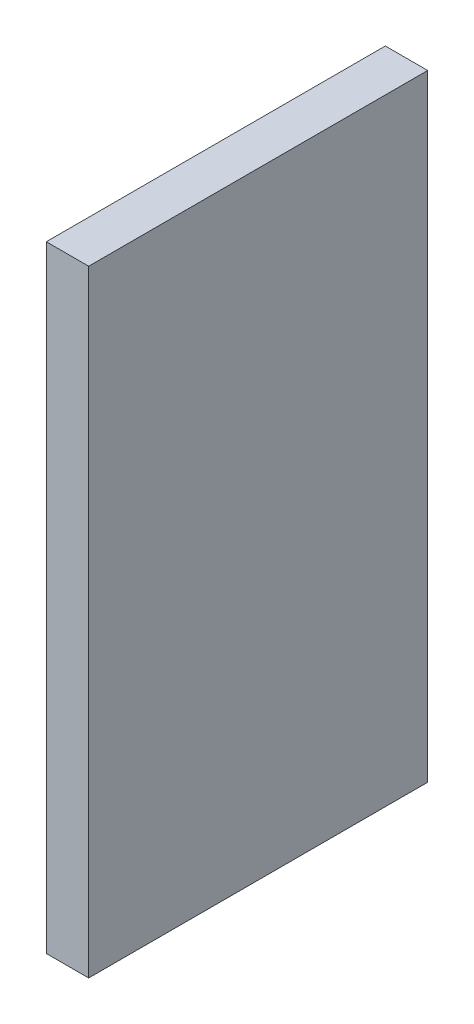
ISO-10303-21;
HEADER;
FILE_DESCRIPTION(('STEP AP214'),'2;1');
FILE_NAME('part.step','',(''),(''),'','','');
FILE_SCHEMA(('AUTOMOTIVE_DESIGN { 1 0 10303 214 1 1 1 1 }'));
ENDSEC;
DATA;
#1=APPLICATION_CONTEXT('core data for automotive mechanical design processes');
#2=APPLICATION_PROTOCOL_DEFINITION('international standard','automotive_design',2000,#1);
#3=PRODUCT_CONTEXT('',#1,'mechanical');
#4=PRODUCT('Part','Part','',(#3));
#5=PRODUCT_RELATED_PRODUCT_CATEGORY('part','',(#4));
#6=PRODUCT_DEFINITION_FORMATION('','',#4);
#7=PRODUCT_DEFINITION_CONTEXT('part definition',#1,'design');
#8=PRODUCT_DEFINITION('design','',#6,#7);
#9=PRODUCT_DEFINITION_SHAPE('','',#8);
#10=(LENGTH_UNIT() NAMED_UNIT(*) SI_UNIT(.MILLI.,.METRE.));
#11=(NAMED_UNIT(*) PLANE_ANGLE_UNIT() SI_UNIT($,.RADIAN.));
#12=(NAMED_UNIT(*) SI_UNIT($,.STERADIAN.) SOLID_ANGLE_UNIT());
#13=UNCERTAINTY_MEASURE_WITH_UNIT(LENGTH_MEASURE(1.E-05),#10,'distance_accuracy_value','');
#14=(GEOMETRIC_REPRESENTATION_CONTEXT(3) GLOBAL_UNCERTAINTY_ASSIGNED_CONTEXT((#13)) GLOBAL_UNIT_ASSIGNED_CONTEXT((#10,
#11,#12)) REPRESENTATION_CONTEXT('',''));
#15=CARTESIAN_POINT('',(0.,0.,0.));
#16=DIRECTION('',(0.,0.,1.));
#17=DIRECTION('',(1.,0.,0.));
#18=AXIS2_PLACEMENT_3D('',#15,#16,#17);
#19=CARTESIAN_POINT('',(-67.5840723809996,476.478485814157,27.94));
#20=DIRECTION('',(0.,-1.,0.));
#21=DIRECTION('',(0.,0.,-1.));
#22=AXIS2_PLACEMENT_3D('',#19,#20,#21);
#23=PLANE('',#22);
#24=DIRECTION('',(-1.,0.,0.));
#25=VECTOR('',#24,1.);
#26=CARTESIAN_POINT('',(-67.5840723809996,476.478485814157,-27.94));
#27=LINE('',#26,#25);
#28=CARTESIAN_POINT('',(-67.5840723809996,476.478485814157,-27.94));
#29=VERTEX_POINT('',#28);
#30=CARTESIAN_POINT('',(-74.5690723809996,476.478485814157,-27.94));
#31=VERTEX_POINT('',#30);
#32=EDGE_CURVE('E105',#29,#31,#27,.T.);
#33=ORIENTED_EDGE('',*,*,#32,.T.);
#34=DIRECTION('',(0.,0.,-1.));
#35=VECTOR('',#34,1.);
#36=CARTESIAN_POINT('',(-74.5690723809996,476.478485814157,27.94));
#37=LINE('',#36,#35);
#38=CARTESIAN_POINT('',(-74.5690723809996,476.478485814157,27.94));
#39=VERTEX_POINT('',#38);
#40=EDGE_CURVE('E11',#39,#31,#37,.T.);
#41=ORIENTED_EDGE('',*,*,#40,.F.);
#42=DIRECTION('',(-1.,0.,0.));
#43=VECTOR('',#42,1.);
#44=CARTESIAN_POINT('',(-67.5840723809996,476.478485814157,27.94));
#45=LINE('',#44,#43);
#46=CARTESIAN_POINT('',(-67.5840723809996,476.478485814157,27.94));
#47=VERTEX_POINT('',#46);
#48=EDGE_CURVE('E89',#47,#39,#45,.T.);
#49=ORIENTED_EDGE('',*,*,#48,.F.);
#50=DIRECTION('',(0.,0.,-1.));
#51=VECTOR('',#50,1.);
#52=CARTESIAN_POINT('',(-67.5840723809996,476.478485814157,27.94));
#53=LINE('',#52,#51);
#54=EDGE_CURVE('E96',#47,#29,#53,.T.);
#55=ORIENTED_EDGE('',*,*,#54,.T.);
#56=EDGE_LOOP('',(#33,#41,#49,#55));
#57=FACE_BOUND('',#56,.T.);
#58=ADVANCED_FACE('F39',(#57),#23,.F.);
#59=CARTESIAN_POINT('',(-74.5690723809996,476.478485814157,27.94));
#60=DIRECTION('',(1.,0.,0.));
#61=DIRECTION('',(0.,1.,0.));
#62=AXIS2_PLACEMENT_3D('',#59,#60,#61);
#63=PLANE('',#62);
#64=DIRECTION('',(0.,-1.,0.));
#65=VECTOR('',#64,1.);
#66=CARTESIAN_POINT('',(-74.5690723809996,476.478485814157,-27.94));
#67=LINE('',#66,#65);
#68=CARTESIAN_POINT('',(-74.5690723809996,374.878485814157,-27.94));
#69=VERTEX_POINT('',#68);
#70=EDGE_CURVE('E94',#31,#69,#67,.T.);
#71=ORIENTED_EDGE('',*,*,#70,.T.);
#72=DIRECTION('',(0.,0.,-1.));
#73=VECTOR('',#72,1.);
#74=CARTESIAN_POINT('',(-74.5690723809996,374.878485814157,27.94));
#75=LINE('',#74,#73);
#76=CARTESIAN_POINT('',(-74.5690723809996,374.878485814157,27.94));
#77=VERTEX_POINT('',#76);
#78=EDGE_CURVE('E50',#77,#69,#75,.T.);
#79=ORIENTED_EDGE('',*,*,#78,.F.);
#80=DIRECTION('',(0.,-1.,0.));
#81=VECTOR('',#80,1.);
#82=CARTESIAN_POINT('',(-74.5690723809996,476.478485814157,27.94));
#83=LINE('',#82,#81);
#84=EDGE_CURVE('E83',#39,#77,#83,.T.);
#85=ORIENTED_EDGE('',*,*,#84,.F.);
#86=ORIENTED_EDGE('',*,*,#40,.T.);
#87=EDGE_LOOP('',(#71,#79,#85,#86));
#88=FACE_BOUND('',#87,.T.);
#89=ADVANCED_FACE('F93',(#88),#63,.F.);
#90=CARTESIAN_POINT('',(-67.5840723809996,374.878485814157,27.94));
#91=DIRECTION('',(0.,1.,0.));
#92=DIRECTION('',(0.,0.,1.));
#93=AXIS2_PLACEMENT_3D('',#90,#91,#92);
#94=PLANE('',#93);
#95=DIRECTION('',(1.,0.,0.));
#96=VECTOR('',#95,1.);
#97=CARTESIAN_POINT('',(-67.5840723809996,374.878485814157,-27.94));
#98=LINE('',#97,#96);
#99=CARTESIAN_POINT('',(-67.5840723809996,374.878485814157,-27.94));
#100=VERTEX_POINT('',#99);
#101=EDGE_CURVE('E75',#69,#100,#98,.T.);
#102=ORIENTED_EDGE('',*,*,#101,.T.);
#103=DIRECTION('',(0.,0.,-1.));
#104=VECTOR('',#103,1.);
#105=CARTESIAN_POINT('',(-67.5840723809996,374.878485814157,27.94));
#106=LINE('',#105,#104);
#107=CARTESIAN_POINT('',(-67.5840723809996,374.878485814157,27.94));
#108=VERTEX_POINT('',#107);
#109=EDGE_CURVE('E91',#108,#100,#106,.T.);
#110=ORIENTED_EDGE('',*,*,#109,.F.);
#111=DIRECTION('',(1.,0.,0.));
#112=VECTOR('',#111,1.);
#113=CARTESIAN_POINT('',(-67.5840723809996,374.878485814157,27.94));
#114=LINE('',#113,#112);
#115=EDGE_CURVE('E86',#77,#108,#114,.T.);
#116=ORIENTED_EDGE('',*,*,#115,.F.);
#117=ORIENTED_EDGE('',*,*,#78,.T.);
#118=EDGE_LOOP('',(#102,#110,#116,#117));
#119=FACE_BOUND('',#118,.T.);
#120=ADVANCED_FACE('F98',(#119),#94,.F.);
#121=CARTESIAN_POINT('',(-67.5840723809996,476.478485814157,27.94));
#122=DIRECTION('',(-1.,0.,0.));
#123=DIRECTION('',(0.,-1.,0.));
#124=AXIS2_PLACEMENT_3D('',#121,#122,#123);
#125=PLANE('',#124);
#126=DIRECTION('',(0.,1.,0.));
#127=VECTOR('',#126,1.);
#128=CARTESIAN_POINT('',(-67.5840723809996,476.478485814157,-27.94));
#129=LINE('',#128,#127);
#130=EDGE_CURVE('E76',#100,#29,#129,.T.);
#131=ORIENTED_EDGE('',*,*,#130,.T.);
#132=ORIENTED_EDGE('',*,*,#54,.F.);
#133=DIRECTION('',(0.,1.,0.));
#134=VECTOR('',#133,1.);
#135=CARTESIAN_POINT('',(-67.5840723809996,476.478485814157,27.94));
#136=LINE('',#135,#134);
#137=EDGE_CURVE('E54',#108,#47,#136,.T.);
#138=ORIENTED_EDGE('',*,*,#137,.F.);
#139=ORIENTED_EDGE('',*,*,#109,.T.);
#140=EDGE_LOOP('',(#131,#132,#138,#139));
#141=FACE_BOUND('',#140,.T.);
#142=ADVANCED_FACE('F107',(#141),#125,.F.);
#143=CARTESIAN_POINT('',(0.,0.,27.94));
#144=DIRECTION('',(0.,0.,1.));
#145=DIRECTION('',(1.,0.,0.));
#146=AXIS2_PLACEMENT_3D('',#143,#144,#145);
#147=PLANE('',#146);
#148=ORIENTED_EDGE('',*,*,#48,.T.);
#149=ORIENTED_EDGE('',*,*,#84,.T.);
#150=ORIENTED_EDGE('',*,*,#115,.T.);
#151=ORIENTED_EDGE('',*,*,#137,.T.);
#152=EDGE_LOOP('',(#148,#149,#150,#151));
#153=FACE_BOUND('',#152,.T.);
#154=ADVANCED_FACE('F88',(#153),#147,.T.);
#155=CARTESIAN_POINT('',(0.,0.,-27.94));
#156=DIRECTION('',(0.,0.,1.));
#157=DIRECTION('',(1.,0.,0.));
#158=AXIS2_PLACEMENT_3D('',#155,#156,#157);
#159=PLANE('',#158);
#160=ORIENTED_EDGE('',*,*,#32,.F.);
#161=ORIENTED_EDGE('',*,*,#130,.F.);
#162=ORIENTED_EDGE('',*,*,#101,.F.);
#163=ORIENTED_EDGE('',*,*,#70,.F.);
#164=EDGE_LOOP('',(#160,#161,#162,#163));
#165=FACE_BOUND('',#164,.T.);
#166=ADVANCED_FACE('F115',(#165),#159,.F.);
#167=CLOSED_SHELL('',(#58,#89,#120,#142,#154,#166));
#168=MANIFOLD_SOLID_BREP('B2',#167);
#169=ADVANCED_BREP_SHAPE_REPRESENTATION('',(#18,#168),#14);
#170=SHAPE_DEFINITION_REPRESENTATION(#9,#169);
ENDSEC;
END-ISO-10303-21;
